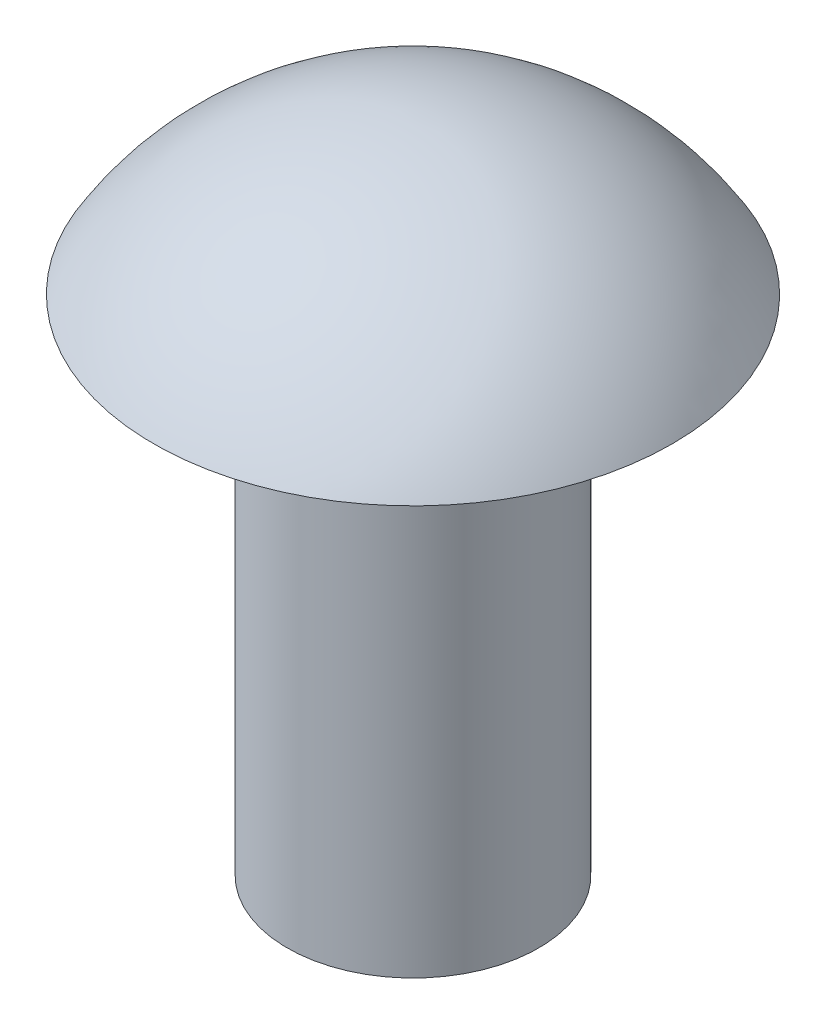
ISO-10303-21;
HEADER;
FILE_DESCRIPTION(('STEP AP214'),'2;1');
FILE_NAME('part.step','',(''),(''),'','','');
FILE_SCHEMA(('AUTOMOTIVE_DESIGN { 1 0 10303 214 1 1 1 1 }'));
ENDSEC;
DATA;
#1=APPLICATION_CONTEXT('core data for automotive mechanical design processes');
#2=APPLICATION_PROTOCOL_DEFINITION('international standard','automotive_design',2000,#1);
#3=PRODUCT_CONTEXT('',#1,'mechanical');
#4=PRODUCT('Part','Part','',(#3));
#5=PRODUCT_RELATED_PRODUCT_CATEGORY('part','',(#4));
#6=PRODUCT_DEFINITION_FORMATION('','',#4);
#7=PRODUCT_DEFINITION_CONTEXT('part definition',#1,'design');
#8=PRODUCT_DEFINITION('design','',#6,#7);
#9=PRODUCT_DEFINITION_SHAPE('','',#8);
#10=(LENGTH_UNIT() NAMED_UNIT(*) SI_UNIT(.MILLI.,.METRE.));
#11=(NAMED_UNIT(*) PLANE_ANGLE_UNIT() SI_UNIT($,.RADIAN.));
#12=(NAMED_UNIT(*) SI_UNIT($,.STERADIAN.) SOLID_ANGLE_UNIT());
#13=UNCERTAINTY_MEASURE_WITH_UNIT(LENGTH_MEASURE(1.E-05),#10,'distance_accuracy_value','');
#14=(GEOMETRIC_REPRESENTATION_CONTEXT(3) GLOBAL_UNCERTAINTY_ASSIGNED_CONTEXT((#13)) GLOBAL_UNIT_ASSIGNED_CONTEXT((#10,
#11,#12)) REPRESENTATION_CONTEXT('',''));
#15=CARTESIAN_POINT('',(0.,0.,0.));
#16=DIRECTION('',(0.,0.,1.));
#17=DIRECTION('',(1.,0.,0.));
#18=AXIS2_PLACEMENT_3D('',#15,#16,#17);
#19=CARTESIAN_POINT('',(0.,-6.92382110224375,0.));
#20=DIRECTION('',(0.,1.,0.));
#21=DIRECTION('',(-1.,0.,0.));
#22=AXIS2_PLACEMENT_3D('',#19,#20,#21);
#23=PLANE('',#22);
#24=CARTESIAN_POINT('',(0.,-6.92382110224375,0.));
#25=DIRECTION('',(0.,1.,0.));
#26=DIRECTION('',(-1.,0.,0.));
#27=AXIS2_PLACEMENT_3D('',#24,#25,#26);
#28=CIRCLE('',#27,2.5);
#29=CARTESIAN_POINT('',(-2.5,-6.92382110224375,0.));
#30=VERTEX_POINT('',#29);
#31=EDGE_CURVE('E10',#30,#30,#28,.T.);
#32=ORIENTED_EDGE('',*,*,#31,.F.);
#33=EDGE_LOOP('',(#32));
#34=FACE_BOUND('',#33,.T.);
#35=ADVANCED_FACE('F31',(#34),#23,.F.);
#36=CARTESIAN_POINT('',(0.,30.7895703494144,0.));
#37=DIRECTION('',(0.,1.,0.));
#38=DIRECTION('',(-1.,0.,0.));
#39=AXIS2_PLACEMENT_3D('',#36,#37,#38);
#40=CYLINDRICAL_SURFACE('',#39,2.5);
#41=CARTESIAN_POINT('',(0.,3.07617889775625,0.));
#42=DIRECTION('',(0.,1.,0.));
#43=DIRECTION('',(-1.,0.,0.));
#44=AXIS2_PLACEMENT_3D('',#41,#42,#43);
#45=CIRCLE('',#44,2.5);
#46=CARTESIAN_POINT('',(-2.49999999999999,3.07617889775625,0.));
#47=VERTEX_POINT('',#46);
#48=EDGE_CURVE('E37',#47,#47,#45,.T.);
#49=ORIENTED_EDGE('',*,*,#48,.F.);
#50=EDGE_LOOP('',(#49));
#51=FACE_BOUND('',#50,.T.);
#52=ORIENTED_EDGE('',*,*,#31,.T.);
#53=EDGE_LOOP('',(#52));
#54=FACE_BOUND('',#53,.T.);
#55=ADVANCED_FACE('F52',(#51,#54),#40,.T.);
#56=CARTESIAN_POINT('',(2.50000000000001,3.07617889775625,0.));
#57=DIRECTION('',(0.,1.,0.));
#58=DIRECTION('',(-1.,0.,0.));
#59=AXIS2_PLACEMENT_3D('',#56,#57,#58);
#60=PLANE('',#59);
#61=CARTESIAN_POINT('',(0.,3.07617889775625,0.));
#62=DIRECTION('',(0.,1.,0.));
#63=DIRECTION('',(-1.,0.,0.));
#64=AXIS2_PLACEMENT_3D('',#61,#62,#63);
#65=CIRCLE('',#64,5.1514195508616);
#66=CARTESIAN_POINT('',(-5.15141955086159,3.07617889775625,0.));
#67=VERTEX_POINT('',#66);
#68=EDGE_CURVE('E41',#67,#67,#65,.T.);
#69=ORIENTED_EDGE('',*,*,#68,.F.);
#70=EDGE_LOOP('',(#69));
#71=FACE_BOUND('',#70,.T.);
#72=ORIENTED_EDGE('',*,*,#48,.T.);
#73=EDGE_LOOP('',(#72));
#74=FACE_BOUND('',#73,.T.);
#75=ADVANCED_FACE('F50',(#71,#74),#60,.F.);
#76=CARTESIAN_POINT('',(0.,0.,0.));
#77=DIRECTION('',(0.,1.,0.));
#78=DIRECTION('',(1.,0.,0.));
#79=AXIS2_PLACEMENT_3D('',#76,#77,#78);
#80=SPHERICAL_SURFACE('',#79,6.);
#81=ORIENTED_EDGE('',*,*,#68,.T.);
#82=EDGE_LOOP('',(#81));
#83=FACE_BOUND('',#82,.T.);
#84=ADVANCED_FACE('F48',(#83),#80,.T.);
#85=CLOSED_SHELL('',(#35,#55,#75,#84));
#86=MANIFOLD_SOLID_BREP('B2',#85);
#87=ADVANCED_BREP_SHAPE_REPRESENTATION('',(#18,#86),#14);
#88=SHAPE_DEFINITION_REPRESENTATION(#9,#87);
ENDSEC;
END-ISO-10303-21;
